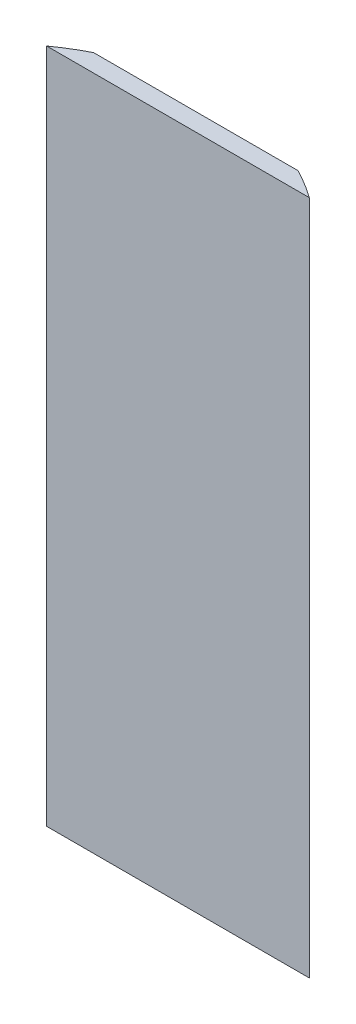
ISO-10303-21;
HEADER;
FILE_DESCRIPTION(('STEP AP214'),'2;1');
FILE_NAME('part.step','',(''),(''),'','','');
FILE_SCHEMA(('AUTOMOTIVE_DESIGN { 1 0 10303 214 1 1 1 1 }'));
ENDSEC;
DATA;
#1=APPLICATION_CONTEXT('core data for automotive mechanical design processes');
#2=APPLICATION_PROTOCOL_DEFINITION('international standard','automotive_design',2000,#1);
#3=PRODUCT_CONTEXT('',#1,'mechanical');
#4=PRODUCT('Part','Part','',(#3));
#5=PRODUCT_RELATED_PRODUCT_CATEGORY('part','',(#4));
#6=PRODUCT_DEFINITION_FORMATION('','',#4);
#7=PRODUCT_DEFINITION_CONTEXT('part definition',#1,'design');
#8=PRODUCT_DEFINITION('design','',#6,#7);
#9=PRODUCT_DEFINITION_SHAPE('','',#8);
#10=(LENGTH_UNIT() NAMED_UNIT(*) SI_UNIT(.MILLI.,.METRE.));
#11=(NAMED_UNIT(*) PLANE_ANGLE_UNIT() SI_UNIT($,.RADIAN.));
#12=(NAMED_UNIT(*) SI_UNIT($,.STERADIAN.) SOLID_ANGLE_UNIT());
#13=UNCERTAINTY_MEASURE_WITH_UNIT(LENGTH_MEASURE(1.E-05),#10,'distance_accuracy_value','');
#14=(GEOMETRIC_REPRESENTATION_CONTEXT(3) GLOBAL_UNCERTAINTY_ASSIGNED_CONTEXT((#13)) GLOBAL_UNIT_ASSIGNED_CONTEXT((#10,
#11,#12)) REPRESENTATION_CONTEXT('',''));
#15=CARTESIAN_POINT('',(0.,0.,0.));
#16=DIRECTION('',(0.,0.,1.));
#17=DIRECTION('',(1.,0.,0.));
#18=AXIS2_PLACEMENT_3D('',#15,#16,#17);
#19=CARTESIAN_POINT('',(0.,60.96,0.));
#20=DIRECTION('',(0.,-1.,0.));
#21=DIRECTION('',(0.,0.,-1.));
#22=AXIS2_PLACEMENT_3D('',#19,#20,#21);
#23=CYLINDRICAL_SURFACE('',#22,20.32);
#24=CARTESIAN_POINT('',(0.,0.,0.));
#25=DIRECTION('',(0.,1.,0.));
#26=DIRECTION('',(0.,0.,-1.));
#27=AXIS2_PLACEMENT_3D('',#24,#25,#26);
#28=CIRCLE('',#27,20.32);
#29=CARTESIAN_POINT('',(-9.21537063606234,0.,-18.1102));
#30=VERTEX_POINT('',#29);
#31=CARTESIAN_POINT('',(-11.8457713974228,0.,-16.51));
#32=VERTEX_POINT('',#31);
#33=EDGE_CURVE('E96',#30,#32,#28,.T.);
#34=ORIENTED_EDGE('',*,*,#33,.T.);
#35=DIRECTION('',(0.,-1.,0.));
#36=VECTOR('',#35,1.);
#37=CARTESIAN_POINT('',(-11.8457713974228,60.96,-16.51));
#38=LINE('',#37,#36);
#39=CARTESIAN_POINT('',(-11.8457713974228,60.96,-16.51));
#40=VERTEX_POINT('',#39);
#41=EDGE_CURVE('E11',#40,#32,#38,.T.);
#42=ORIENTED_EDGE('',*,*,#41,.F.);
#43=CARTESIAN_POINT('',(0.,60.96,0.));
#44=DIRECTION('',(0.,1.,0.));
#45=DIRECTION('',(0.,0.,-1.));
#46=AXIS2_PLACEMENT_3D('',#43,#44,#45);
#47=CIRCLE('',#46,20.32);
#48=CARTESIAN_POINT('',(-9.21537063606234,60.96,-18.1102));
#49=VERTEX_POINT('',#48);
#50=EDGE_CURVE('E84',#49,#40,#47,.T.);
#51=ORIENTED_EDGE('',*,*,#50,.F.);
#52=DIRECTION('',(0.,-1.,0.));
#53=VECTOR('',#52,1.);
#54=CARTESIAN_POINT('',(-9.21537063606234,60.96,-18.1102));
#55=LINE('',#54,#53);
#56=EDGE_CURVE('E92',#49,#30,#55,.T.);
#57=ORIENTED_EDGE('',*,*,#56,.T.);
#58=EDGE_LOOP('',(#34,#42,#51,#57));
#59=FACE_BOUND('',#58,.T.);
#60=ADVANCED_FACE('F33',(#59),#23,.T.);
#61=CARTESIAN_POINT('',(-11.8457713974228,60.96,-16.51));
#62=DIRECTION('',(0.,0.,-1.));
#63=DIRECTION('',(-1.,0.,0.));
#64=AXIS2_PLACEMENT_3D('',#61,#62,#63);
#65=PLANE('',#64);
#66=DIRECTION('',(1.,0.,0.));
#67=VECTOR('',#66,1.);
#68=CARTESIAN_POINT('',(-11.8457713974228,0.,-16.51));
#69=LINE('',#68,#67);
#70=CARTESIAN_POINT('',(11.8457713974228,0.,-16.51));
#71=VERTEX_POINT('',#70);
#72=EDGE_CURVE('E88',#32,#71,#69,.T.);
#73=ORIENTED_EDGE('',*,*,#72,.T.);
#74=DIRECTION('',(0.,-1.,0.));
#75=VECTOR('',#74,1.);
#76=CARTESIAN_POINT('',(11.8457713974228,60.96,-16.51));
#77=LINE('',#76,#75);
#78=CARTESIAN_POINT('',(11.8457713974228,60.96,-16.51));
#79=VERTEX_POINT('',#78);
#80=EDGE_CURVE('E41',#79,#71,#77,.T.);
#81=ORIENTED_EDGE('',*,*,#80,.F.);
#82=DIRECTION('',(1.,0.,0.));
#83=VECTOR('',#82,1.);
#84=CARTESIAN_POINT('',(-11.8457713974228,60.96,-16.51));
#85=LINE('',#84,#83);
#86=EDGE_CURVE('E79',#40,#79,#85,.T.);
#87=ORIENTED_EDGE('',*,*,#86,.F.);
#88=ORIENTED_EDGE('',*,*,#41,.T.);
#89=EDGE_LOOP('',(#73,#81,#87,#88));
#90=FACE_BOUND('',#89,.T.);
#91=ADVANCED_FACE('F87',(#90),#65,.F.);
#92=CARTESIAN_POINT('',(0.,60.96,0.));
#93=DIRECTION('',(0.,-1.,0.));
#94=DIRECTION('',(0.,0.,-1.));
#95=AXIS2_PLACEMENT_3D('',#92,#93,#94);
#96=CYLINDRICAL_SURFACE('',#95,20.32);
#97=CARTESIAN_POINT('',(0.,0.,0.));
#98=DIRECTION('',(0.,1.,0.));
#99=DIRECTION('',(0.,0.,1.));
#100=AXIS2_PLACEMENT_3D('',#97,#98,#99);
#101=CIRCLE('',#100,20.32);
#102=CARTESIAN_POINT('',(9.21537063606234,0.,-18.1102));
#103=VERTEX_POINT('',#102);
#104=EDGE_CURVE('E66',#71,#103,#101,.T.);
#105=ORIENTED_EDGE('',*,*,#104,.T.);
#106=DIRECTION('',(0.,-1.,0.));
#107=VECTOR('',#106,1.);
#108=CARTESIAN_POINT('',(9.21537063606234,60.96,-18.1102));
#109=LINE('',#108,#107);
#110=CARTESIAN_POINT('',(9.21537063606234,60.96,-18.1102));
#111=VERTEX_POINT('',#110);
#112=EDGE_CURVE('E89',#111,#103,#109,.T.);
#113=ORIENTED_EDGE('',*,*,#112,.F.);
#114=CARTESIAN_POINT('',(0.,60.96,0.));
#115=DIRECTION('',(0.,1.,0.));
#116=DIRECTION('',(0.,0.,1.));
#117=AXIS2_PLACEMENT_3D('',#114,#115,#116);
#118=CIRCLE('',#117,20.32);
#119=EDGE_CURVE('E82',#79,#111,#118,.T.);
#120=ORIENTED_EDGE('',*,*,#119,.F.);
#121=ORIENTED_EDGE('',*,*,#80,.T.);
#122=EDGE_LOOP('',(#105,#113,#120,#121));
#123=FACE_BOUND('',#122,.T.);
#124=ADVANCED_FACE('F90',(#123),#96,.T.);
#125=CARTESIAN_POINT('',(-9.21537063606234,60.96,-18.1102));
#126=DIRECTION('',(0.,0.,1.));
#127=DIRECTION('',(1.,0.,0.));
#128=AXIS2_PLACEMENT_3D('',#125,#126,#127);
#129=PLANE('',#128);
#130=DIRECTION('',(-1.,0.,0.));
#131=VECTOR('',#130,1.);
#132=CARTESIAN_POINT('',(-9.21537063606234,0.,-18.1102));
#133=LINE('',#132,#131);
#134=EDGE_CURVE('E72',#103,#30,#133,.T.);
#135=ORIENTED_EDGE('',*,*,#134,.T.);
#136=ORIENTED_EDGE('',*,*,#56,.F.);
#137=DIRECTION('',(-1.,0.,0.));
#138=VECTOR('',#137,1.);
#139=CARTESIAN_POINT('',(-9.21537063606234,60.96,-18.1102));
#140=LINE('',#139,#138);
#141=EDGE_CURVE('E49',#111,#49,#140,.T.);
#142=ORIENTED_EDGE('',*,*,#141,.F.);
#143=ORIENTED_EDGE('',*,*,#112,.T.);
#144=EDGE_LOOP('',(#135,#136,#142,#143));
#145=FACE_BOUND('',#144,.T.);
#146=ADVANCED_FACE('F103',(#145),#129,.F.);
#147=CARTESIAN_POINT('',(0.,60.96,0.));
#148=DIRECTION('',(0.,-1.,0.));
#149=DIRECTION('',(0.,0.,-1.));
#150=AXIS2_PLACEMENT_3D('',#147,#148,#149);
#151=PLANE('',#150);
#152=ORIENTED_EDGE('',*,*,#50,.T.);
#153=ORIENTED_EDGE('',*,*,#86,.T.);
#154=ORIENTED_EDGE('',*,*,#119,.T.);
#155=ORIENTED_EDGE('',*,*,#141,.T.);
#156=EDGE_LOOP('',(#152,#153,#154,#155));
#157=FACE_BOUND('',#156,.T.);
#158=ADVANCED_FACE('F80',(#157),#151,.F.);
#159=CARTESIAN_POINT('',(0.,0.,0.));
#160=DIRECTION('',(0.,-1.,0.));
#161=DIRECTION('',(0.,0.,-1.));
#162=AXIS2_PLACEMENT_3D('',#159,#160,#161);
#163=PLANE('',#162);
#164=ORIENTED_EDGE('',*,*,#33,.F.);
#165=ORIENTED_EDGE('',*,*,#134,.F.);
#166=ORIENTED_EDGE('',*,*,#104,.F.);
#167=ORIENTED_EDGE('',*,*,#72,.F.);
#168=EDGE_LOOP('',(#164,#165,#166,#167));
#169=FACE_BOUND('',#168,.T.);
#170=ADVANCED_FACE('F106',(#169),#163,.T.);
#171=CLOSED_SHELL('',(#60,#91,#124,#146,#158,#170));
#172=MANIFOLD_SOLID_BREP('B2',#171);
#173=ADVANCED_BREP_SHAPE_REPRESENTATION('',(#18,#172),#14);
#174=SHAPE_DEFINITION_REPRESENTATION(#9,#173);
ENDSEC;
END-ISO-10303-21;
